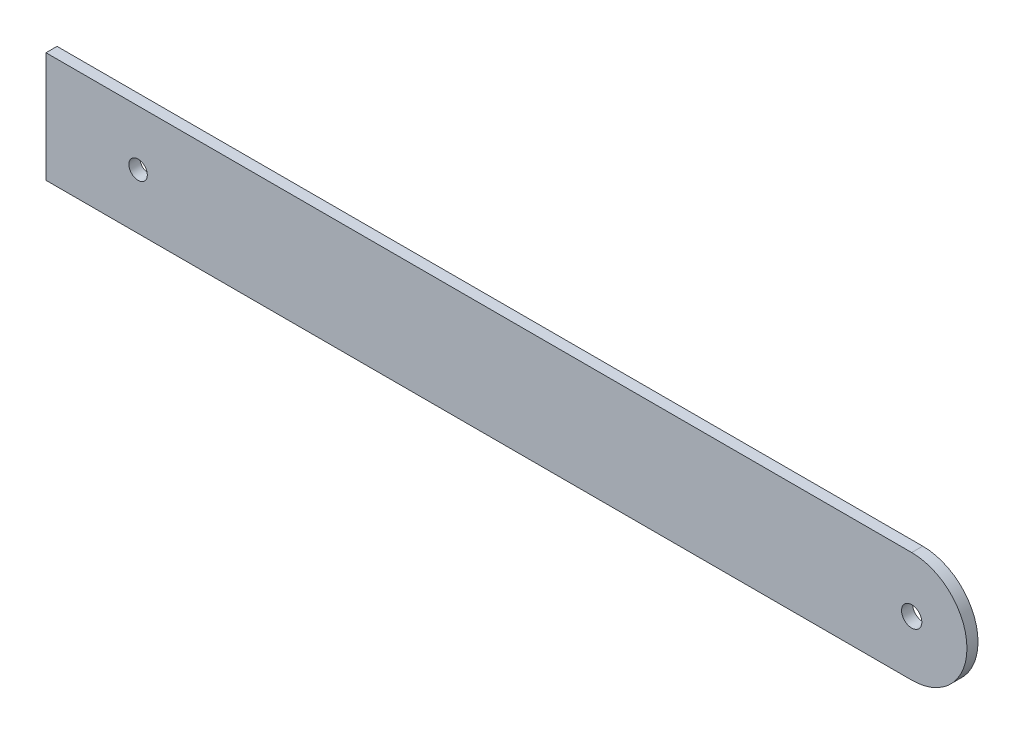
ISO-10303-21;
HEADER;
FILE_DESCRIPTION(('STEP AP214'),'2;1');
FILE_NAME('part.step','',(''),(''),'','','');
FILE_SCHEMA(('AUTOMOTIVE_DESIGN { 1 0 10303 214 1 1 1 1 }'));
ENDSEC;
DATA;
#1=APPLICATION_CONTEXT('core data for automotive mechanical design processes');
#2=APPLICATION_PROTOCOL_DEFINITION('international standard','automotive_design',2000,#1);
#3=PRODUCT_CONTEXT('',#1,'mechanical');
#4=PRODUCT('Part','Part','',(#3));
#5=PRODUCT_RELATED_PRODUCT_CATEGORY('part','',(#4));
#6=PRODUCT_DEFINITION_FORMATION('','',#4);
#7=PRODUCT_DEFINITION_CONTEXT('part definition',#1,'design');
#8=PRODUCT_DEFINITION('design','',#6,#7);
#9=PRODUCT_DEFINITION_SHAPE('','',#8);
#10=(LENGTH_UNIT() NAMED_UNIT(*) SI_UNIT(.MILLI.,.METRE.));
#11=(NAMED_UNIT(*) PLANE_ANGLE_UNIT() SI_UNIT($,.RADIAN.));
#12=(NAMED_UNIT(*) SI_UNIT($,.STERADIAN.) SOLID_ANGLE_UNIT());
#13=UNCERTAINTY_MEASURE_WITH_UNIT(LENGTH_MEASURE(1.E-05),#10,'distance_accuracy_value','');
#14=(GEOMETRIC_REPRESENTATION_CONTEXT(3) GLOBAL_UNCERTAINTY_ASSIGNED_CONTEXT((#13)) GLOBAL_UNIT_ASSIGNED_CONTEXT((#10,
#11,#12)) REPRESENTATION_CONTEXT('',''));
#15=CARTESIAN_POINT('',(0.,0.,0.));
#16=DIRECTION('',(0.,0.,1.));
#17=DIRECTION('',(1.,0.,0.));
#18=AXIS2_PLACEMENT_3D('',#15,#16,#17);
#19=CARTESIAN_POINT('',(235.,-15.,3.));
#20=DIRECTION('',(0.,0.,-1.));
#21=DIRECTION('',(-1.,0.,0.));
#22=AXIS2_PLACEMENT_3D('',#19,#20,#21);
#23=PLANE('',#22);
#24=DIRECTION('',(0.,-1.,0.));
#25=VECTOR('',#24,1.);
#26=CARTESIAN_POINT('',(0.,-30.,3.));
#27=LINE('',#26,#25);
#28=CARTESIAN_POINT('',(0.,0.,3.));
#29=VERTEX_POINT('',#28);
#30=CARTESIAN_POINT('',(0.,-30.,3.));
#31=VERTEX_POINT('',#30);
#32=EDGE_CURVE('E89',#29,#31,#27,.T.);
#33=ORIENTED_EDGE('',*,*,#32,.T.);
#34=DIRECTION('',(1.,0.,0.));
#35=VECTOR('',#34,1.);
#36=CARTESIAN_POINT('',(235.,-30.,3.));
#37=LINE('',#36,#35);
#38=CARTESIAN_POINT('',(235.,-30.,3.));
#39=VERTEX_POINT('',#38);
#40=EDGE_CURVE('E84',#31,#39,#37,.T.);
#41=ORIENTED_EDGE('',*,*,#40,.T.);
#42=CARTESIAN_POINT('',(235.,-15.,3.));
#43=DIRECTION('',(0.,0.,1.));
#44=DIRECTION('',(-1.,0.,0.));
#45=AXIS2_PLACEMENT_3D('',#42,#43,#44);
#46=CIRCLE('',#45,15.);
#47=CARTESIAN_POINT('',(235.,0.,3.));
#48=VERTEX_POINT('',#47);
#49=EDGE_CURVE('E87',#39,#48,#46,.T.);
#50=ORIENTED_EDGE('',*,*,#49,.T.);
#51=DIRECTION('',(-1.,0.,0.));
#52=VECTOR('',#51,1.);
#53=CARTESIAN_POINT('',(0.,0.,3.));
#54=LINE('',#53,#52);
#55=EDGE_CURVE('E54',#48,#29,#54,.T.);
#56=ORIENTED_EDGE('',*,*,#55,.T.);
#57=EDGE_LOOP('',(#33,#41,#50,#56));
#58=FACE_BOUND('',#57,.T.);
#59=CARTESIAN_POINT('',(235.,-15.,3.));
#60=DIRECTION('',(0.,0.,1.));
#61=DIRECTION('',(1.,0.,0.));
#62=AXIS2_PLACEMENT_3D('',#59,#60,#61);
#63=CIRCLE('',#62,2.75000000000001);
#64=CARTESIAN_POINT('',(237.75,-15.,3.));
#65=VERTEX_POINT('',#64);
#66=EDGE_CURVE('E104',#65,#65,#63,.T.);
#67=ORIENTED_EDGE('',*,*,#66,.F.);
#68=EDGE_LOOP('',(#67));
#69=FACE_BOUND('',#68,.T.);
#70=CARTESIAN_POINT('',(25.,-15.,3.));
#71=DIRECTION('',(0.,0.,1.));
#72=DIRECTION('',(1.,0.,0.));
#73=AXIS2_PLACEMENT_3D('',#70,#71,#72);
#74=CIRCLE('',#73,2.5);
#75=CARTESIAN_POINT('',(27.5,-15.,3.));
#76=VERTEX_POINT('',#75);
#77=EDGE_CURVE('E119',#76,#76,#74,.T.);
#78=ORIENTED_EDGE('',*,*,#77,.F.);
#79=EDGE_LOOP('',(#78));
#80=FACE_BOUND('',#79,.T.);
#81=ADVANCED_FACE('F37',(#58,#69,#80),#23,.F.);
#82=CARTESIAN_POINT('',(235.,-15.,0.));
#83=DIRECTION('',(0.,0.,-1.));
#84=DIRECTION('',(-1.,0.,0.));
#85=AXIS2_PLACEMENT_3D('',#82,#83,#84);
#86=PLANE('',#85);
#87=CARTESIAN_POINT('',(235.,-15.,0.));
#88=DIRECTION('',(0.,0.,1.));
#89=DIRECTION('',(1.,0.,0.));
#90=AXIS2_PLACEMENT_3D('',#87,#88,#89);
#91=CIRCLE('',#90,2.75000000000001);
#92=CARTESIAN_POINT('',(237.75,-15.,0.));
#93=VERTEX_POINT('',#92);
#94=EDGE_CURVE('E116',#93,#93,#91,.T.);
#95=ORIENTED_EDGE('',*,*,#94,.T.);
#96=EDGE_LOOP('',(#95));
#97=FACE_BOUND('',#96,.T.);
#98=DIRECTION('',(0.,-1.,0.));
#99=VECTOR('',#98,1.);
#100=CARTESIAN_POINT('',(0.,-30.,0.));
#101=LINE('',#100,#99);
#102=CARTESIAN_POINT('',(0.,0.,0.));
#103=VERTEX_POINT('',#102);
#104=CARTESIAN_POINT('',(0.,-30.,0.));
#105=VERTEX_POINT('',#104);
#106=EDGE_CURVE('E101',#103,#105,#101,.T.);
#107=ORIENTED_EDGE('',*,*,#106,.F.);
#108=DIRECTION('',(-1.,0.,0.));
#109=VECTOR('',#108,1.);
#110=CARTESIAN_POINT('',(0.,0.,0.));
#111=LINE('',#110,#109);
#112=CARTESIAN_POINT('',(235.,0.,0.));
#113=VERTEX_POINT('',#112);
#114=EDGE_CURVE('E77',#113,#103,#111,.T.);
#115=ORIENTED_EDGE('',*,*,#114,.F.);
#116=CARTESIAN_POINT('',(235.,-15.,0.));
#117=DIRECTION('',(0.,0.,1.));
#118=DIRECTION('',(-1.,0.,0.));
#119=AXIS2_PLACEMENT_3D('',#116,#117,#118);
#120=CIRCLE('',#119,15.);
#121=CARTESIAN_POINT('',(235.,-30.,0.));
#122=VERTEX_POINT('',#121);
#123=EDGE_CURVE('E71',#122,#113,#120,.T.);
#124=ORIENTED_EDGE('',*,*,#123,.F.);
#125=DIRECTION('',(1.,0.,0.));
#126=VECTOR('',#125,1.);
#127=CARTESIAN_POINT('',(235.,-30.,0.));
#128=LINE('',#127,#126);
#129=EDGE_CURVE('E93',#105,#122,#128,.T.);
#130=ORIENTED_EDGE('',*,*,#129,.F.);
#131=EDGE_LOOP('',(#107,#115,#124,#130));
#132=FACE_BOUND('',#131,.T.);
#133=CARTESIAN_POINT('',(25.,-15.,0.));
#134=DIRECTION('',(0.,0.,1.));
#135=DIRECTION('',(1.,0.,0.));
#136=AXIS2_PLACEMENT_3D('',#133,#134,#135);
#137=CIRCLE('',#136,2.5);
#138=CARTESIAN_POINT('',(27.5,-15.,0.));
#139=VERTEX_POINT('',#138);
#140=EDGE_CURVE('E122',#139,#139,#137,.T.);
#141=ORIENTED_EDGE('',*,*,#140,.T.);
#142=EDGE_LOOP('',(#141));
#143=FACE_BOUND('',#142,.T.);
#144=ADVANCED_FACE('F112',(#97,#132,#143),#86,.T.);
#145=CARTESIAN_POINT('',(0.,-30.,3.));
#146=DIRECTION('',(1.,0.,0.));
#147=DIRECTION('',(0.,1.,0.));
#148=AXIS2_PLACEMENT_3D('',#145,#146,#147);
#149=PLANE('',#148);
#150=ORIENTED_EDGE('',*,*,#106,.T.);
#151=DIRECTION('',(0.,0.,-1.));
#152=VECTOR('',#151,1.);
#153=CARTESIAN_POINT('',(0.,-30.,3.));
#154=LINE('',#153,#152);
#155=EDGE_CURVE('E11',#31,#105,#154,.T.);
#156=ORIENTED_EDGE('',*,*,#155,.F.);
#157=ORIENTED_EDGE('',*,*,#32,.F.);
#158=DIRECTION('',(0.,0.,-1.));
#159=VECTOR('',#158,1.);
#160=CARTESIAN_POINT('',(0.,0.,3.));
#161=LINE('',#160,#159);
#162=EDGE_CURVE('E97',#29,#103,#161,.T.);
#163=ORIENTED_EDGE('',*,*,#162,.T.);
#164=EDGE_LOOP('',(#150,#156,#157,#163));
#165=FACE_BOUND('',#164,.T.);
#166=ADVANCED_FACE('F39',(#165),#149,.F.);
#167=CARTESIAN_POINT('',(235.,-30.,3.));
#168=DIRECTION('',(0.,1.,0.));
#169=DIRECTION('',(-1.,0.,0.));
#170=AXIS2_PLACEMENT_3D('',#167,#168,#169);
#171=PLANE('',#170);
#172=ORIENTED_EDGE('',*,*,#129,.T.);
#173=DIRECTION('',(0.,0.,-1.));
#174=VECTOR('',#173,1.);
#175=CARTESIAN_POINT('',(235.,-30.,3.));
#176=LINE('',#175,#174);
#177=EDGE_CURVE('E46',#39,#122,#176,.T.);
#178=ORIENTED_EDGE('',*,*,#177,.F.);
#179=ORIENTED_EDGE('',*,*,#40,.F.);
#180=ORIENTED_EDGE('',*,*,#155,.T.);
#181=EDGE_LOOP('',(#172,#178,#179,#180));
#182=FACE_BOUND('',#181,.T.);
#183=ADVANCED_FACE('F92',(#182),#171,.F.);
#184=CARTESIAN_POINT('',(235.,-15.,3.));
#185=DIRECTION('',(0.,0.,-1.));
#186=DIRECTION('',(-1.,0.,0.));
#187=AXIS2_PLACEMENT_3D('',#184,#185,#186);
#188=CYLINDRICAL_SURFACE('',#187,15.);
#189=ORIENTED_EDGE('',*,*,#123,.T.);
#190=DIRECTION('',(0.,0.,-1.));
#191=VECTOR('',#190,1.);
#192=CARTESIAN_POINT('',(235.,0.,3.));
#193=LINE('',#192,#191);
#194=EDGE_CURVE('E94',#48,#113,#193,.T.);
#195=ORIENTED_EDGE('',*,*,#194,.F.);
#196=ORIENTED_EDGE('',*,*,#49,.F.);
#197=ORIENTED_EDGE('',*,*,#177,.T.);
#198=EDGE_LOOP('',(#189,#195,#196,#197));
#199=FACE_BOUND('',#198,.T.);
#200=ADVANCED_FACE('F95',(#199),#188,.T.);
#201=CARTESIAN_POINT('',(0.,0.,3.));
#202=DIRECTION('',(0.,-1.,0.));
#203=DIRECTION('',(1.,0.,0.));
#204=AXIS2_PLACEMENT_3D('',#201,#202,#203);
#205=PLANE('',#204);
#206=ORIENTED_EDGE('',*,*,#114,.T.);
#207=ORIENTED_EDGE('',*,*,#162,.F.);
#208=ORIENTED_EDGE('',*,*,#55,.F.);
#209=ORIENTED_EDGE('',*,*,#194,.T.);
#210=EDGE_LOOP('',(#206,#207,#208,#209));
#211=FACE_BOUND('',#210,.T.);
#212=ADVANCED_FACE('F109',(#211),#205,.F.);
#213=CARTESIAN_POINT('',(235.,-15.,3.));
#214=DIRECTION('',(0.,0.,-1.));
#215=DIRECTION('',(-1.,0.,0.));
#216=AXIS2_PLACEMENT_3D('',#213,#214,#215);
#217=CYLINDRICAL_SURFACE('',#216,2.75000000000001);
#218=ORIENTED_EDGE('',*,*,#66,.T.);
#219=EDGE_LOOP('',(#218));
#220=FACE_BOUND('',#219,.T.);
#221=ORIENTED_EDGE('',*,*,#94,.F.);
#222=EDGE_LOOP('',(#221));
#223=FACE_BOUND('',#222,.T.);
#224=ADVANCED_FACE('F139',(#220,#223),#217,.F.);
#225=CARTESIAN_POINT('',(25.,-15.,3.));
#226=DIRECTION('',(0.,0.,-1.));
#227=DIRECTION('',(-1.,0.,0.));
#228=AXIS2_PLACEMENT_3D('',#225,#226,#227);
#229=CYLINDRICAL_SURFACE('',#228,2.5);
#230=ORIENTED_EDGE('',*,*,#77,.T.);
#231=EDGE_LOOP('',(#230));
#232=FACE_BOUND('',#231,.T.);
#233=ORIENTED_EDGE('',*,*,#140,.F.);
#234=EDGE_LOOP('',(#233));
#235=FACE_BOUND('',#234,.T.);
#236=ADVANCED_FACE('F128',(#232,#235),#229,.F.);
#237=CLOSED_SHELL('',(#81,#144,#166,#183,#200,#212,#224,#236));
#238=MANIFOLD_SOLID_BREP('B2',#237);
#239=ADVANCED_BREP_SHAPE_REPRESENTATION('',(#18,#238),#14);
#240=SHAPE_DEFINITION_REPRESENTATION(#9,#239);
ENDSEC;
END-ISO-10303-21;
